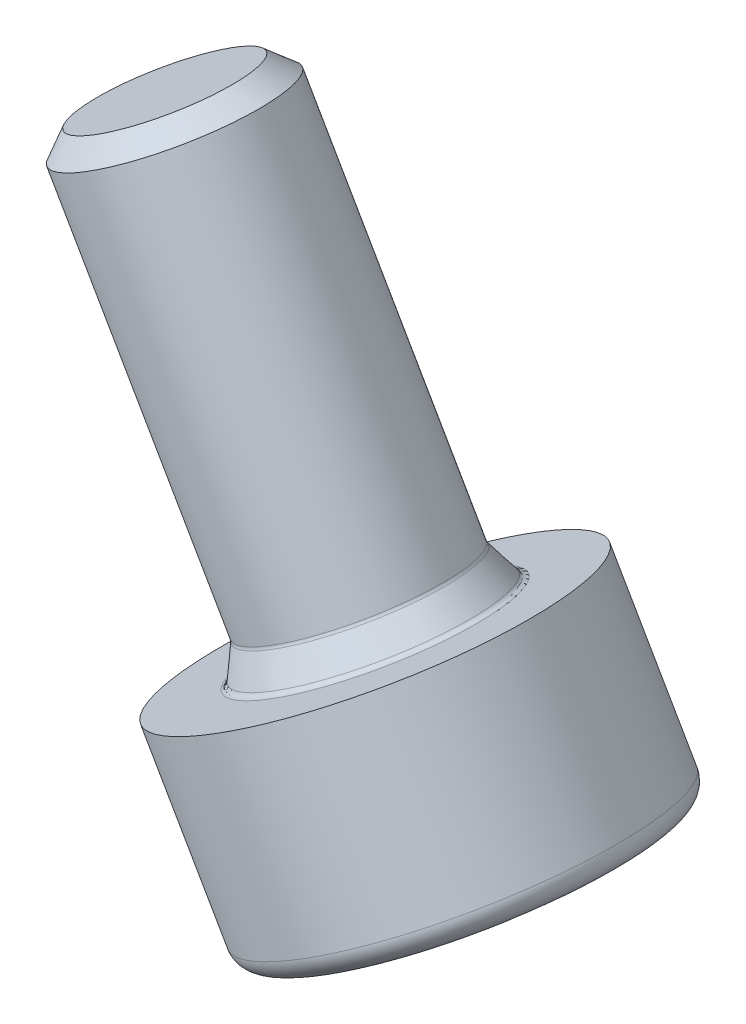
ISO-10303-21;
HEADER;
FILE_DESCRIPTION(('STEP AP214'),'2;1');
FILE_NAME('part.step','',(''),(''),'','','');
FILE_SCHEMA(('AUTOMOTIVE_DESIGN { 1 0 10303 214 1 1 1 1 }'));
ENDSEC;
DATA;
#1=APPLICATION_CONTEXT('core data for automotive mechanical design processes');
#2=APPLICATION_PROTOCOL_DEFINITION('international standard','automotive_design',2000,#1);
#3=PRODUCT_CONTEXT('',#1,'mechanical');
#4=PRODUCT('Part','Part','',(#3));
#5=PRODUCT_RELATED_PRODUCT_CATEGORY('part','',(#4));
#6=PRODUCT_DEFINITION_FORMATION('','',#4);
#7=PRODUCT_DEFINITION_CONTEXT('part definition',#1,'design');
#8=PRODUCT_DEFINITION('design','',#6,#7);
#9=PRODUCT_DEFINITION_SHAPE('','',#8);
#10=(LENGTH_UNIT() NAMED_UNIT(*) SI_UNIT(.MILLI.,.METRE.));
#11=(NAMED_UNIT(*) PLANE_ANGLE_UNIT() SI_UNIT($,.RADIAN.));
#12=(NAMED_UNIT(*) SI_UNIT($,.STERADIAN.) SOLID_ANGLE_UNIT());
#13=UNCERTAINTY_MEASURE_WITH_UNIT(LENGTH_MEASURE(1.E-05),#10,'distance_accuracy_value','');
#14=(GEOMETRIC_REPRESENTATION_CONTEXT(3) GLOBAL_UNCERTAINTY_ASSIGNED_CONTEXT((#13)) GLOBAL_UNIT_ASSIGNED_CONTEXT((#10,
#11,#12)) REPRESENTATION_CONTEXT('',''));
#15=CARTESIAN_POINT('',(0.,0.,0.));
#16=DIRECTION('',(0.,0.,1.));
#17=DIRECTION('',(1.,0.,0.));
#18=AXIS2_PLACEMENT_3D('',#15,#16,#17);
#19=CARTESIAN_POINT('',(231.177788229063,786.535581039937,-362.357299098567));
#20=DIRECTION('',(-0.499999999999994,0.866025403784442,0.));
#21=DIRECTION('',(-0.866025403784442,-0.499999999999994,0.));
#22=AXIS2_PLACEMENT_3D('',#19,#20,#21);
#23=PLANE('',#22);
#24=DIRECTION('',(0.00124392228932108,0.000718178868590491,0.999998968437693));
#25=VECTOR('',#24,1.);
#26=CARTESIAN_POINT('',(230.094359867446,785.910063383709,-363.077190743416));
#27=LINE('',#26,#25);
#28=CARTESIAN_POINT('',(230.095257591401,785.91058168443,-362.355503651395));
#29=VERTEX_POINT('',#28);
#30=CARTESIAN_POINT('',(230.094359867446,785.910063383709,-363.077190743416));
#31=VERTEX_POINT('',#30);
#32=EDGE_CURVE('E164',#29,#31,#27,.F.);
#33=ORIENTED_EDGE('',*,*,#32,.T.);
#34=DIRECTION('',(0.749377265183522,0.432653165778486,-0.501243406508175));
#35=VECTOR('',#34,1.);
#36=CARTESIAN_POINT('',(230.094359867446,785.910063383709,-363.077190743416));
#37=LINE('',#36,#35);
#38=CARTESIAN_POINT('',(230.63517632495,786.222303910585,-363.438932012837));
#39=VERTEX_POINT('',#38);
#40=EDGE_CURVE('E160',#31,#39,#37,.T.);
#41=ORIENTED_EDGE('',*,*,#40,.T.);
#42=CARTESIAN_POINT('',(231.17778822945,786.535581039268,-362.357299098567));
#43=DIRECTION('',(0.499999999999982,-0.866025403784449,-1.76969799723513E-13));
#44=DIRECTION('',(0.866025403784449,0.499999999999982,0.));
#45=AXIS2_PLACEMENT_3D('',#42,#43,#44);
#46=CIRCLE('',#45,1.2499999995943);
#47=EDGE_CURVE('E161',#39,#29,#46,.F.);
#48=ORIENTED_EDGE('',*,*,#47,.T.);
#49=EDGE_LOOP('',(#33,#41,#48));
#50=FACE_BOUND('',#49,.T.);
#51=ADVANCED_FACE('F17',(#50),#23,.F.);
#52=CARTESIAN_POINT('',(231.177788229063,786.535581039937,-362.357299098567));
#53=DIRECTION('',(-0.499999999999994,0.866025403784442,0.));
#54=DIRECTION('',(-0.866025403784442,-0.499999999999994,0.));
#55=AXIS2_PLACEMENT_3D('',#52,#53,#54);
#56=PLANE('',#55);
#57=DIRECTION('',(-0.750621187472531,-0.433371344647624,-0.498755561929525));
#58=VECTOR('',#57,1.);
#59=CARTESIAN_POINT('',(230.637869495426,786.223858813731,-361.273870736949));
#60=LINE('',#59,#58);
#61=CARTESIAN_POINT('',(230.637869495707,786.223858813447,-361.273870737125));
#62=VERTEX_POINT('',#61);
#63=CARTESIAN_POINT('',(230.096155314618,785.911099985617,-361.633816559374));
#64=VERTEX_POINT('',#63);
#65=EDGE_CURVE('E524',#62,#64,#60,.T.);
#66=ORIENTED_EDGE('',*,*,#65,.T.);
#67=DIRECTION('',(0.00124392228932108,0.000718178868590491,0.999998968437693));
#68=VECTOR('',#67,1.);
#69=CARTESIAN_POINT('',(230.094359867446,785.910063383709,-363.077190743416));
#70=LINE('',#69,#68);
#71=EDGE_CURVE('E552',#64,#29,#70,.F.);
#72=ORIENTED_EDGE('',*,*,#71,.T.);
#73=CARTESIAN_POINT('',(231.17778822945,786.535581039268,-362.357299098567));
#74=DIRECTION('',(0.499999999999982,-0.866025403784449,-1.76969799723513E-13));
#75=DIRECTION('',(0.866025403784449,0.499999999999982,0.));
#76=AXIS2_PLACEMENT_3D('',#73,#74,#75);
#77=CIRCLE('',#76,1.24999999959429);
#78=EDGE_CURVE('E179',#62,#29,#77,.T.);
#79=ORIENTED_EDGE('',*,*,#78,.F.);
#80=EDGE_LOOP('',(#66,#72,#79));
#81=FACE_BOUND('',#80,.T.);
#82=ADVANCED_FACE('F756',(#81),#56,.F.);
#83=CARTESIAN_POINT('',(230.094359867446,785.910063383709,-363.077190743416));
#84=DIRECTION('',(-0.866024510425279,-0.49999948421884,0.001436357737181));
#85=DIRECTION('',(0.499999999999994,-0.866025403784442,0.));
#86=AXIS2_PLACEMENT_3D('',#83,#84,#85);
#87=PLANE('',#86);
#88=DIRECTION('',(0.00124392228932108,0.000718178868590491,0.999998968437693));
#89=VECTOR('',#88,1.);
#90=CARTESIAN_POINT('',(231.019359867446,784.307916386708,-363.077190743416));
#91=LINE('',#90,#89);
#92=CARTESIAN_POINT('',(231.019359867446,784.307916386708,-363.077190743416));
#93=VERTEX_POINT('',#92);
#94=CARTESIAN_POINT('',(231.01938089054,784.307928524356,-363.060290125977));
#95=VERTEX_POINT('',#94);
#96=EDGE_CURVE('E428',#93,#95,#91,.T.);
#97=ORIENTED_EDGE('',*,*,#96,.F.);
#98=DIRECTION('',(-0.50000000000004,0.866025403784416,0.));
#99=VECTOR('',#98,1.);
#100=CARTESIAN_POINT('',(231.019359867446,784.307916386708,-363.077190743416));
#101=LINE('',#100,#99);
#102=EDGE_CURVE('E169',#93,#31,#101,.T.);
#103=ORIENTED_EDGE('',*,*,#102,.T.);
#104=ORIENTED_EDGE('',*,*,#32,.F.);
#105=ORIENTED_EDGE('',*,*,#71,.F.);
#106=DIRECTION('',(0.49999999999974,-0.866025403784589,-1.80036166155497E-13));
#107=VECTOR('',#106,1.);
#108=CARTESIAN_POINT('',(230.096155314618,785.911099985617,-361.633816559374));
#109=LINE('',#108,#107);
#110=CARTESIAN_POINT('',(231.021155314617,784.308952988616,-361.633816559374));
#111=VERTEX_POINT('',#110);
#112=EDGE_CURVE('E514',#64,#111,#109,.T.);
#113=ORIENTED_EDGE('',*,*,#112,.T.);
#114=DIRECTION('',(0.00124392228932108,0.000718178868590491,0.999998968437693));
#115=VECTOR('',#114,1.);
#116=CARTESIAN_POINT('',(231.019359867446,784.307916386708,-363.077190743416));
#117=LINE('',#116,#115);
#118=CARTESIAN_POINT('',(231.021134291597,784.308940850841,-361.650717176661));
#119=VERTEX_POINT('',#118);
#120=EDGE_CURVE('E182',#119,#111,#117,.T.);
#121=ORIENTED_EDGE('',*,*,#120,.F.);
#122=CARTESIAN_POINT('',(231.019380890574,784.307928524254,-363.060290126216));
#123=CARTESIAN_POINT('',(231.007583608695,784.328500835787,-363.011966594581));
#124=CARTESIAN_POINT('',(230.996499364921,784.347840408368,-362.962849637441));
#125=CARTESIAN_POINT('',(230.976230728111,784.383234326375,-362.862732187299));
#126=CARTESIAN_POINT('',(230.967058205752,784.399268138707,-362.811722115185));
#127=CARTESIAN_POINT('',(230.951272231896,784.426907345349,-362.708301649146));
#128=CARTESIAN_POINT('',(230.944649205501,784.438529306504,-362.655897300736));
#129=CARTESIAN_POINT('',(230.934505803146,784.456402434034,-362.549990893219));
#130=CARTESIAN_POINT('',(230.930976331509,784.462669343971,-362.496492528635));
#131=CARTESIAN_POINT('',(230.928682481364,784.46683842095,-362.428260299855));
#132=CARTESIAN_POINT('',(230.928320229856,784.467507640084,-362.413716195168));
#133=CARTESIAN_POINT('',(230.927848669362,784.468408001708,-362.384616618869));
#134=CARTESIAN_POINT('',(230.927739245638,784.468639342905,-362.370061155412));
#135=CARTESIAN_POINT('',(230.927805399981,784.468675564302,-362.31756590289));
#136=CARTESIAN_POINT('',(230.928720959577,784.467198792846,-362.279614295807));
#137=CARTESIAN_POINT('',(230.932236862941,784.461326267422,-362.204007221366));
#138=CARTESIAN_POINT('',(230.934838394426,784.456928455614,-362.166351981732));
#139=CARTESIAN_POINT('',(230.945010491775,784.439632897603,-362.053903990347));
#140=CARTESIAN_POINT('',(230.954946572876,784.422635608005,-361.979929564824));
#141=CARTESIAN_POINT('',(230.974724278398,784.388714251387,-361.863442616628));
#142=CARTESIAN_POINT('',(230.983104965188,784.374323661394,-361.819865310955));
#143=CARTESIAN_POINT('',(231.001199910739,784.343228217182,-361.73425969141));
#144=CARTESIAN_POINT('',(231.010902105865,784.326544286762,-361.692221292683));
#145=CARTESIAN_POINT('',(231.021134291617,784.308940850806,-361.650717176578));
#146=B_SPLINE_CURVE_WITH_KNOTS('',3,(#122,#123,#124,#125,#126,#127,#128,#129,#130,#131,#132,
#133,#134,#135,#136,#137,#138,#139,#140,#141,#142,#143,#144,#145),.UNSPECIFIED.,.F.,.F.,(4,2,2,
2,2,2,2,2,2,2,2,4),(0.,0.16159297617679,0.324161275137199,0.486112932434917,0.647586806154177,
0.691272786513411,0.734938937457356,0.848735605540267,0.962612527244451,1.19125625184068,
1.33113310605229,1.46980937840952),.UNSPECIFIED.);
#147=EDGE_CURVE('E423',#95,#119,#146,.T.);
#148=ORIENTED_EDGE('',*,*,#147,.F.);
#149=EDGE_LOOP('',(#97,#103,#104,#105,#113,#121,#148));
#150=FACE_BOUND('',#149,.T.);
#151=ADVANCED_FACE('F414',(#150),#87,.F.);
#152=CARTESIAN_POINT('',(231.175992781892,786.534544438029,-363.800673282609));
#153=DIRECTION('',(-0.434089523515526,-0.250621703254081,-0.865306331556685));
#154=DIRECTION('',(-0.893832919324595,0.,0.448400169861333));
#155=AXIS2_PLACEMENT_3D('',#152,#153,#154);
#156=PLANE('',#155);
#157=DIRECTION('',(-0.50000000000004,0.866025403784416,0.));
#158=VECTOR('',#157,1.);
#159=CARTESIAN_POINT('',(232.100992781892,784.932397441028,-363.800673282608));
#160=LINE('',#159,#158);
#161=CARTESIAN_POINT('',(232.100992781892,784.932397441028,-363.800673282609));
#162=VERTEX_POINT('',#161);
#163=CARTESIAN_POINT('',(231.175992781892,786.534544438029,-363.800673282609));
#164=VERTEX_POINT('',#163);
#165=EDGE_CURVE('E174',#162,#164,#160,.T.);
#166=ORIENTED_EDGE('',*,*,#165,.T.);
#167=DIRECTION('',(-0.749377265183826,-0.432653165778377,0.501243406507815));
#168=VECTOR('',#167,1.);
#169=CARTESIAN_POINT('',(231.175992781892,786.534544438029,-363.800673282609));
#170=LINE('',#169,#168);
#171=EDGE_CURVE('E148',#164,#39,#170,.T.);
#172=ORIENTED_EDGE('',*,*,#171,.T.);
#173=ORIENTED_EDGE('',*,*,#40,.F.);
#174=ORIENTED_EDGE('',*,*,#102,.F.);
#175=DIRECTION('',(-0.749377265177957,-0.432653165787645,0.50124340650859));
#176=VECTOR('',#175,1.);
#177=CARTESIAN_POINT('',(231.032024818752,784.315228499754,-363.085662075055));
#178=LINE('',#177,#176);
#179=CARTESIAN_POINT('',(231.032024818937,784.315228499733,-363.085662075153));
#180=VERTEX_POINT('',#179);
#181=EDGE_CURVE('E422',#180,#93,#178,.T.);
#182=ORIENTED_EDGE('',*,*,#181,.F.);
#183=CARTESIAN_POINT('',(232.088327830592,784.925085327822,-363.792201950952));
#184=CARTESIAN_POINT('',(232.04025784459,784.924715583866,-363.767980074342));
#185=CARTESIAN_POINT('',(231.992305334087,784.922769252727,-363.743360498026));
#186=CARTESIAN_POINT('',(231.896886340439,784.914775091985,-363.693177234494));
#187=CARTESIAN_POINT('',(231.849424537679,784.908702577971,-363.667608745807));
#188=CARTESIAN_POINT('',(231.756008890717,784.891522271947,-363.615769865633));
#189=CARTESIAN_POINT('',(231.710050009512,784.880433666739,-363.589502504424));
#190=CARTESIAN_POINT('',(231.620410931783,784.852409944692,-363.536417561188));
#191=CARTESIAN_POINT('',(231.576724412772,784.835492172516,-363.509601831018));
#192=CARTESIAN_POINT('',(231.523213953201,784.810091326258,-363.475400840953));
#193=CARTESIAN_POINT('',(231.5119345773,784.804457540685,-363.468110696856));
#194=CARTESIAN_POINT('',(231.489620235759,784.792746966789,-363.453524711054));
#195=CARTESIAN_POINT('',(231.478585161503,784.786670380709,-363.446228873439));
#196=CARTESIAN_POINT('',(231.439247226418,784.763956640464,-363.419915947089));
#197=CARTESIAN_POINT('',(231.411675476246,784.74603271305,-363.400892934657));
#198=CARTESIAN_POINT('',(231.358439049063,784.707394214312,-363.36299534802));
#199=CARTESIAN_POINT('',(231.332775730704,784.686677683836,-363.344120887961));
#200=CARTESIAN_POINT('',(231.258541896164,784.620650338326,-363.287757015559));
#201=CARTESIAN_POINT('',(231.212951148855,784.5715946194,-363.250677784267));
#202=CARTESIAN_POINT('',(231.1452911928,784.487191105333,-363.19228940931));
#203=CARTESIAN_POINT('',(231.120961796916,784.453915340303,-363.170446549635));
#204=CARTESIAN_POINT('',(231.074799284384,784.385720835368,-363.127537253014));
#205=CARTESIAN_POINT('',(231.052946534186,784.350818648771,-363.106465761094));
#206=CARTESIAN_POINT('',(231.032024818886,784.315228499656,-363.085662075094));
#207=B_SPLINE_CURVE_WITH_KNOTS('',3,(#183,#184,#185,#186,#187,#188,#189,#190,#191,#192,#193,
#194,#195,#196,#197,#198,#199,#200,#201,#202,#203,#204,#205,#206),.UNSPECIFIED.,.F.,.F.,(4,2,2,
2,2,2,2,2,2,2,2,4),(0.,0.161592976179455,0.324161275141715,0.486112932437444,0.647586806155135,
0.691272786514263,0.734938937458076,0.848735605541466,0.962612527245416,1.1912562518407,
1.33113310605297,1.46980937841171),.UNSPECIFIED.);
#208=CARTESIAN_POINT('',(232.088327830442,784.925085327899,-363.792201950874));
#209=VERTEX_POINT('',#208);
#210=EDGE_CURVE('E417',#209,#180,#207,.T.);
#211=ORIENTED_EDGE('',*,*,#210,.F.);
#212=DIRECTION('',(-0.749377265175107,-0.432653165793516,0.501243406507782));
#213=VECTOR('',#212,1.);
#214=CARTESIAN_POINT('',(232.100992781892,784.932397441028,-363.800673282609));
#215=LINE('',#214,#213);
#216=EDGE_CURVE('E168',#162,#209,#215,.T.);
#217=ORIENTED_EDGE('',*,*,#216,.F.);
#218=EDGE_LOOP('',(#166,#172,#173,#174,#182,#211,#217));
#219=FACE_BOUND('',#218,.T.);
#220=ADVANCED_FACE('F171',(#219),#156,.F.);
#221=CARTESIAN_POINT('',(231.177788229063,786.535581039937,-362.357299098567));
#222=DIRECTION('',(-0.499999999999994,0.866025403784442,0.));
#223=DIRECTION('',(-0.866025403784442,-0.499999999999994,0.));
#224=AXIS2_PLACEMENT_3D('',#221,#222,#223);
#225=PLANE('',#224);
#226=ORIENTED_EDGE('',*,*,#171,.F.);
#227=DIRECTION('',(0.750621187472963,0.433371344646899,0.498755561929507));
#228=VECTOR('',#227,1.);
#229=CARTESIAN_POINT('',(231.175992781892,786.534544438029,-363.800673282608));
#230=LINE('',#229,#228);
#231=CARTESIAN_POINT('',(231.717706962807,786.847303265758,-363.440727460008));
#232=VERTEX_POINT('',#231);
#233=EDGE_CURVE('E150',#164,#232,#230,.T.);
#234=ORIENTED_EDGE('',*,*,#233,.T.);
#235=CARTESIAN_POINT('',(231.17778822945,786.535581039268,-362.357299098567));
#236=DIRECTION('',(0.499999999999982,-0.866025403784449,-1.76969799723513E-13));
#237=DIRECTION('',(0.866025403784449,0.499999999999982,0.));
#238=AXIS2_PLACEMENT_3D('',#235,#236,#237);
#239=CIRCLE('',#238,1.24999999959421);
#240=EDGE_CURVE('E144',#232,#39,#239,.F.);
#241=ORIENTED_EDGE('',*,*,#240,.T.);
#242=EDGE_LOOP('',(#226,#234,#241));
#243=FACE_BOUND('',#242,.T.);
#244=ADVANCED_FACE('F146',(#243),#225,.F.);
#245=CARTESIAN_POINT('',(231.177788229418,786.535581039324,-362.357299098567));
#246=DIRECTION('',(0.499999999999982,-0.866025403784449,-1.76969799723513E-13));
#247=DIRECTION('',(0.866025403784449,0.499999999999982,0.));
#248=AXIS2_PLACEMENT_3D('',#245,#246,#247);
#249=CONICAL_SURFACE('',#248,1.24999999948057,1.04719754998824);
#250=CARTESIAN_POINT('',(231.17778822945,786.535581039268,-362.357299098567));
#251=DIRECTION('',(0.499999999999982,-0.866025403784449,-1.76969799723513E-13));
#252=DIRECTION('',(0.866025403784449,0.499999999999982,0.));
#253=AXIS2_PLACEMENT_3D('',#250,#251,#252);
#254=CIRCLE('',#253,1.24999999959426);
#255=CARTESIAN_POINT('',(231.720400133563,786.848858168618,-361.275666184297));
#256=VERTEX_POINT('',#255);
#257=EDGE_CURVE('E155',#256,#62,#254,.T.);
#258=ORIENTED_EDGE('',*,*,#257,.T.);
#259=ORIENTED_EDGE('',*,*,#78,.T.);
#260=ORIENTED_EDGE('',*,*,#47,.F.);
#261=ORIENTED_EDGE('',*,*,#240,.F.);
#262=CARTESIAN_POINT('',(231.17778822945,786.535581039268,-362.357299098567));
#263=DIRECTION('',(0.499999999999982,-0.866025403784449,-1.76969799723513E-13));
#264=DIRECTION('',(0.866025403784449,0.499999999999982,0.));
#265=AXIS2_PLACEMENT_3D('',#262,#263,#264);
#266=CIRCLE('',#265,1.24999999959419);
#267=CARTESIAN_POINT('',(232.260318867113,787.160580394774,-362.359094545738));
#268=VERTEX_POINT('',#267);
#269=EDGE_CURVE('E382',#232,#268,#266,.T.);
#270=ORIENTED_EDGE('',*,*,#269,.T.);
#271=CARTESIAN_POINT('',(231.17778822945,786.535581039268,-362.357299098567));
#272=DIRECTION('',(0.499999999999982,-0.866025403784449,-1.76969799723513E-13));
#273=DIRECTION('',(0.866025403784449,0.499999999999982,0.));
#274=AXIS2_PLACEMENT_3D('',#271,#272,#273);
#275=CIRCLE('',#274,1.24999999959424);
#276=EDGE_CURVE('E793',#268,#256,#275,.T.);
#277=ORIENTED_EDGE('',*,*,#276,.T.);
#278=EDGE_LOOP('',(#258,#259,#260,#261,#270,#277));
#279=FACE_BOUND('',#278,.T.);
#280=CARTESIAN_POINT('',(230.816944310339,787.160581040775,-362.357299098595));
#281=VERTEX_POINT('',#280);
#282=VERTEX_LOOP('',#281);
#283=FACE_BOUND('',#282,.T.);
#284=ADVANCED_FACE('F176',(#279,#283),#249,.F.);
#285=CARTESIAN_POINT('',(231.177788229063,786.535581039937,-362.357299098567));
#286=DIRECTION('',(-0.499999999999994,0.866025403784442,0.));
#287=DIRECTION('',(-0.866025403784442,-0.499999999999994,0.));
#288=AXIS2_PLACEMENT_3D('',#285,#286,#287);
#289=PLANE('',#288);
#290=DIRECTION('',(-0.74937726518358,-0.432653165778369,0.501243406508189));
#291=VECTOR('',#290,1.);
#292=CARTESIAN_POINT('',(231.720400133458,786.848858169004,-361.275666184121));
#293=LINE('',#292,#291);
#294=CARTESIAN_POINT('',(231.179583676235,786.536617641844,-360.913924914525));
#295=VERTEX_POINT('',#294);
#296=EDGE_CURVE('E509',#256,#295,#293,.T.);
#297=ORIENTED_EDGE('',*,*,#296,.T.);
#298=DIRECTION('',(-0.750621187473525,-0.433371344645908,-0.498755561929521));
#299=VECTOR('',#298,1.);
#300=CARTESIAN_POINT('',(231.179583676235,786.536617641844,-360.913924914525));
#301=LINE('',#300,#299);
#302=EDGE_CURVE('E519',#295,#62,#301,.T.);
#303=ORIENTED_EDGE('',*,*,#302,.T.);
#304=ORIENTED_EDGE('',*,*,#257,.F.);
#305=EDGE_LOOP('',(#297,#303,#304));
#306=FACE_BOUND('',#305,.T.);
#307=ADVANCED_FACE('F402',(#306),#289,.F.);
#308=CARTESIAN_POINT('',(230.096155314618,785.911099985617,-361.633816559374));
#309=DIRECTION('',(-0.431934986909754,-0.24937778096476,0.866742689293866));
#310=DIRECTION('',(0.895019691172795,0.,0.446026627470776));
#311=AXIS2_PLACEMENT_3D('',#308,#309,#310);
#312=PLANE('',#311);
#313=ORIENTED_EDGE('',*,*,#112,.F.);
#314=ORIENTED_EDGE('',*,*,#65,.F.);
#315=ORIENTED_EDGE('',*,*,#302,.F.);
#316=DIRECTION('',(0.500000000000029,-0.866025403784422,0.));
#317=VECTOR('',#316,1.);
#318=CARTESIAN_POINT('',(231.179583676235,786.536617641844,-360.913924914525));
#319=LINE('',#318,#317);
#320=CARTESIAN_POINT('',(232.104583676235,784.934470644843,-360.913924914525));
#321=VERTEX_POINT('',#320);
#322=EDGE_CURVE('E505',#295,#321,#319,.T.);
#323=ORIENTED_EDGE('',*,*,#322,.T.);
#324=DIRECTION('',(0.750621187497313,0.43337134460588,0.498755561928502));
#325=VECTOR('',#324,1.);
#326=CARTESIAN_POINT('',(232.091897701852,784.927146394119,-360.922354200012));
#327=LINE('',#326,#325);
#328=CARTESIAN_POINT('',(232.091897701769,784.927146393942,-360.922354200092));
#329=VERTEX_POINT('',#328);
#330=EDGE_CURVE('E517',#329,#321,#327,.T.);
#331=ORIENTED_EDGE('',*,*,#330,.F.);
#332=CARTESIAN_POINT('',(231.033841289117,784.316277239245,-361.625387273832));
#333=CARTESIAN_POINT('',(231.058256600569,784.357756901285,-361.601285618806));
#334=CARTESIAN_POINT('',(231.083979525777,784.398347102787,-361.576788237981));
#335=CARTESIAN_POINT('',(231.138736707345,784.477057197231,-361.526854051369));
#336=CARTESIAN_POINT('',(231.167790012756,784.515160701517,-361.501412467942));
#337=CARTESIAN_POINT('',(231.229505064853,784.587545146354,-361.449830882077));
#338=CARTESIAN_POINT('',(231.262152706262,784.621840038138,-361.423693894877));
#339=CARTESIAN_POINT('',(231.331373239806,784.685533955422,-361.370872430597));
#340=CARTESIAN_POINT('',(231.36793426767,784.714947126036,-361.344189796184));
#341=CARTESIAN_POINT('',(231.416772151268,784.748637123258,-361.310158557469));
#342=CARTESIAN_POINT('',(231.427308932397,784.75559890182,-361.302904596879));
#343=CARTESIAN_POINT('',(231.448643955306,784.769089300239,-361.288391006381));
#344=CARTESIAN_POINT('',(231.459442076236,784.775618115276,-361.28113138054));
#345=CARTESIAN_POINT('',(231.498847019934,784.798366597293,-361.254949054367));
#346=CARTESIAN_POINT('',(231.528202680386,784.813309725728,-361.236020459716));
#347=CARTESIAN_POINT('',(231.588376864866,784.840148874161,-361.198310971912));
#348=CARTESIAN_POINT('',(231.619196405957,784.852042737794,-361.179530192337));
#349=CARTESIAN_POINT('',(231.713634558494,784.883398209427,-361.123446073355));
#350=CARTESIAN_POINT('',(231.779005449469,784.898406222234,-361.086550879124));
#351=CARTESIAN_POINT('',(231.886075915707,784.914883364514,-361.028452305886));
#352=CARTESIAN_POINT('',(231.927112478334,784.919346653225,-361.006717859887));
#353=CARTESIAN_POINT('',(232.009358395119,784.925288789524,-360.964021536963));
#354=CARTESIAN_POINT('',(232.050563243013,784.92679292416,-360.943054630155));
#355=CARTESIAN_POINT('',(232.09189770187,784.927146393954,-360.92235420005));
#356=B_SPLINE_CURVE_WITH_KNOTS('',3,(#332,#333,#334,#335,#336,#337,#338,#339,#340,#341,#342,
#343,#344,#345,#346,#347,#348,#349,#350,#351,#352,#353,#354,#355),.UNSPECIFIED.,.F.,.F.,(4,2,2,
2,2,2,2,2,2,2,2,4),(0.,0.161592976179371,0.32416127514145,0.486112932436945,0.647586806154291,
0.691272786513653,0.734938937457772,0.848735605541371,0.962612527245353,1.19125625184065,
1.33113310605191,1.46980937840978),.UNSPECIFIED.);
#357=CARTESIAN_POINT('',(231.033841289145,784.316277239424,-361.625387273791));
#358=VERTEX_POINT('',#357);
#359=EDGE_CURVE('E383',#358,#329,#356,.T.);
#360=ORIENTED_EDGE('',*,*,#359,.F.);
#361=DIRECTION('',(0.750621187495367,0.433371344605704,0.498755561931584));
#362=VECTOR('',#361,1.);
#363=CARTESIAN_POINT('',(231.021155314617,784.308952988616,-361.633816559374));
#364=LINE('',#363,#362);
#365=EDGE_CURVE('E381',#111,#358,#364,.T.);
#366=ORIENTED_EDGE('',*,*,#365,.F.);
#367=EDGE_LOOP('',(#313,#314,#315,#323,#331,#360,#366));
#368=FACE_BOUND('',#367,.T.);
#369=ADVANCED_FACE('F396',(#368),#312,.F.);
#370=CARTESIAN_POINT('',(232.259421143509,787.160062094256,-363.080781637759));
#371=DIRECTION('',(0.431934986909754,0.24937778096476,-0.866742689293866));
#372=DIRECTION('',(-0.895019691172795,0.,-0.446026627470776));
#373=AXIS2_PLACEMENT_3D('',#370,#371,#372);
#374=PLANE('',#373);
#375=DIRECTION('',(-0.499999999999994,0.866025403784442,0.));
#376=VECTOR('',#375,1.);
#377=CARTESIAN_POINT('',(232.25942114351,787.160062094256,-363.080781637759));
#378=LINE('',#377,#376);
#379=CARTESIAN_POINT('',(233.184421143509,785.557915097255,-363.080781637759));
#380=VERTEX_POINT('',#379);
#381=CARTESIAN_POINT('',(232.259421143509,787.160062094256,-363.080781637759));
#382=VERTEX_POINT('',#381);
#383=EDGE_CURVE('E802',#380,#382,#378,.T.);
#384=ORIENTED_EDGE('',*,*,#383,.T.);
#385=DIRECTION('',(-0.750621187472558,-0.433371344646763,-0.498755561930234));
#386=VECTOR('',#385,1.);
#387=CARTESIAN_POINT('',(232.259421143509,787.160062094257,-363.080781637759));
#388=LINE('',#387,#386);
#389=EDGE_CURVE('E823',#382,#232,#388,.T.);
#390=ORIENTED_EDGE('',*,*,#389,.T.);
#391=ORIENTED_EDGE('',*,*,#233,.F.);
#392=ORIENTED_EDGE('',*,*,#165,.F.);
#393=DIRECTION('',(-0.750621187485129,-0.433371344626342,-0.498755561929059));
#394=VECTOR('',#393,1.);
#395=CARTESIAN_POINT('',(232.113678756274,784.939721691752,-363.792243997122));
#396=LINE('',#395,#394);
#397=CARTESIAN_POINT('',(232.113678756431,784.939721691715,-363.792243997043));
#398=VERTEX_POINT('',#397);
#399=EDGE_CURVE('E380',#398,#162,#396,.T.);
#400=ORIENTED_EDGE('',*,*,#399,.F.);
#401=CARTESIAN_POINT('',(233.171735169151,785.550590846382,-363.089210923301));
#402=CARTESIAN_POINT('',(233.123605072357,785.550186397443,-363.113312578327));
#403=CARTESIAN_POINT('',(233.075591464108,785.548204791505,-363.137809959152));
#404=CARTESIAN_POINT('',(232.980047932001,785.540138728449,-363.187744145764));
#405=CARTESIAN_POINT('',(232.932522676611,785.534029580042,-363.213185729191));
#406=CARTESIAN_POINT('',(232.838978382495,785.516774999549,-363.264767315056));
#407=CARTESIAN_POINT('',(232.792954314285,785.505648758607,-363.290904302257));
#408=CARTESIAN_POINT('',(232.703183497078,785.477548976736,-363.343725766536));
#409=CARTESIAN_POINT('',(232.659430430189,785.460592783125,-363.37040840095));
#410=CARTESIAN_POINT('',(232.605835094942,785.435142933873,-363.404439639664));
#411=CARTESIAN_POINT('',(232.594537627288,785.429498703022,-363.411693600254));
#412=CARTESIAN_POINT('',(232.572187088095,785.417767230402,-363.426207190752));
#413=CARTESIAN_POINT('',(232.561133907952,785.411680190883,-363.433466816593));
#414=CARTESIAN_POINT('',(232.521730672779,785.388928749614,-363.459649142765));
#415=CARTESIAN_POINT('',(232.494111713716,785.370977566135,-363.478577737416));
#416=CARTESIAN_POINT('',(232.440781237117,785.33228476794,-363.516287225221));
#417=CARTESIAN_POINT('',(232.415071078516,785.311541194239,-363.535068004796));
#418=CARTESIAN_POINT('',(232.340697367266,785.245433090872,-363.591152123778));
#419=CARTESIAN_POINT('',(232.295014601427,785.196324245023,-363.628047318009));
#420=CARTESIAN_POINT('',(232.227209744511,785.111837072406,-363.686145891247));
#421=CARTESIAN_POINT('',(232.202826141789,785.078530011043,-363.707880337246));
#422=CARTESIAN_POINT('',(232.156557142409,785.010274025898,-363.75057666017));
#423=CARTESIAN_POINT('',(232.134652099656,784.97534164818,-363.771543566979));
#424=CARTESIAN_POINT('',(232.113678756407,784.939721691655,-363.792243997083));
#425=B_SPLINE_CURVE_WITH_KNOTS('',3,(#401,#402,#403,#404,#405,#406,#407,#408,#409,#410,#411,
#412,#413,#414,#415,#416,#417,#418,#419,#420,#421,#422,#423,#424),.UNSPECIFIED.,.F.,.F.,(4,2,2,
2,2,2,2,2,2,2,2,4),(0.,0.161592976179436,0.324161275141778,0.486112932437504,0.647586806155194,
0.691272786514085,0.734938937457693,0.848735605541069,0.96261252724501,1.19125625184018,
1.33113310605259,1.4698093784119),.UNSPECIFIED.);
#426=CARTESIAN_POINT('',(233.171735168982,785.550590846447,-363.089210923342));
#427=VERTEX_POINT('',#426);
#428=EDGE_CURVE('E372',#427,#398,#425,.T.);
#429=ORIENTED_EDGE('',*,*,#428,.F.);
#430=DIRECTION('',(-0.750621187481045,-0.433371344631502,-0.498755561930722));
#431=VECTOR('',#430,1.);
#432=CARTESIAN_POINT('',(233.184421143509,785.557915097255,-363.080781637759));
#433=LINE('',#432,#431);
#434=EDGE_CURVE('E496',#380,#427,#433,.T.);
#435=ORIENTED_EDGE('',*,*,#434,.F.);
#436=EDGE_LOOP('',(#384,#390,#391,#392,#400,#429,#435));
#437=FACE_BOUND('',#436,.T.);
#438=ADVANCED_FACE('F391',(#437),#374,.F.);
#439=CARTESIAN_POINT('',(231.177788229063,786.535581039937,-362.357299098567));
#440=DIRECTION('',(-0.499999999999994,0.866025403784442,0.));
#441=DIRECTION('',(-0.866025403784442,-0.499999999999994,0.));
#442=AXIS2_PLACEMENT_3D('',#439,#440,#441);
#443=PLANE('',#442);
#444=ORIENTED_EDGE('',*,*,#389,.F.);
#445=DIRECTION('',(0.00124392228932108,0.000718178868590491,0.999998968437693));
#446=VECTOR('',#445,1.);
#447=CARTESIAN_POINT('',(232.261216590681,787.161098696164,-361.637407453717));
#448=LINE('',#447,#446);
#449=EDGE_CURVE('E816',#382,#268,#448,.T.);
#450=ORIENTED_EDGE('',*,*,#449,.T.);
#451=ORIENTED_EDGE('',*,*,#269,.F.);
#452=EDGE_LOOP('',(#444,#450,#451));
#453=FACE_BOUND('',#452,.T.);
#454=ADVANCED_FACE('F395',(#453),#443,.F.);
#455=CARTESIAN_POINT('',(231.177788229063,786.535581039937,-362.357299098567));
#456=DIRECTION('',(-0.499999999999994,0.866025403784442,0.));
#457=DIRECTION('',(-0.866025403784442,-0.499999999999994,0.));
#458=AXIS2_PLACEMENT_3D('',#455,#456,#457);
#459=PLANE('',#458);
#460=DIRECTION('',(0.00124392228932108,0.000718178868590491,0.999998968437693));
#461=VECTOR('',#460,1.);
#462=CARTESIAN_POINT('',(232.261216590681,787.161098696164,-361.637407453717));
#463=LINE('',#462,#461);
#464=CARTESIAN_POINT('',(232.261216590681,787.161098696164,-361.637407453717));
#465=VERTEX_POINT('',#464);
#466=EDGE_CURVE('E339',#268,#465,#463,.T.);
#467=ORIENTED_EDGE('',*,*,#466,.T.);
#468=DIRECTION('',(-0.74937726518348,-0.432653165778619,0.501243406508123));
#469=VECTOR('',#468,1.);
#470=CARTESIAN_POINT('',(232.261216590681,787.161098696164,-361.637407453718));
#471=LINE('',#470,#469);
#472=EDGE_CURVE('E528',#465,#256,#471,.T.);
#473=ORIENTED_EDGE('',*,*,#472,.T.);
#474=ORIENTED_EDGE('',*,*,#276,.F.);
#475=EDGE_LOOP('',(#467,#473,#474));
#476=FACE_BOUND('',#475,.T.);
#477=ADVANCED_FACE('F704',(#476),#459,.F.);
#478=CARTESIAN_POINT('',(231.179583676235,786.536617641844,-360.913924914525));
#479=DIRECTION('',(0.434089523515526,0.250621703254081,0.865306331556685));
#480=DIRECTION('',(0.893832919324595,0.,-0.448400169861333));
#481=AXIS2_PLACEMENT_3D('',#478,#479,#480);
#482=PLANE('',#481);
#483=ORIENTED_EDGE('',*,*,#322,.F.);
#484=ORIENTED_EDGE('',*,*,#296,.F.);
#485=ORIENTED_EDGE('',*,*,#472,.F.);
#486=DIRECTION('',(-0.499999999999994,0.866025403784442,0.));
#487=VECTOR('',#486,1.);
#488=CARTESIAN_POINT('',(232.261216590681,787.161098696164,-361.637407453717));
#489=LINE('',#488,#487);
#490=CARTESIAN_POINT('',(233.186216590681,785.558951699163,-361.637407453717));
#491=VERTEX_POINT('',#490);
#492=EDGE_CURVE('E333',#465,#491,#489,.F.);
#493=ORIENTED_EDGE('',*,*,#492,.T.);
#494=DIRECTION('',(0.749377265190201,0.432653165767217,-0.501243406507915));
#495=VECTOR('',#494,1.);
#496=CARTESIAN_POINT('',(233.173551639374,785.551639586117,-361.628936122078));
#497=LINE('',#496,#495);
#498=CARTESIAN_POINT('',(233.173551639319,785.551639585957,-361.628936122017));
#499=VERTEX_POINT('',#498);
#500=EDGE_CURVE('E808',#499,#491,#497,.T.);
#501=ORIENTED_EDGE('',*,*,#500,.F.);
#502=CARTESIAN_POINT('',(232.117248627677,784.941782757804,-360.922396246182));
#503=CARTESIAN_POINT('',(232.141603828337,784.983227714863,-360.946618122792));
#504=CARTESIAN_POINT('',(232.167265655799,785.023782641564,-360.971237699108));
#505=CARTESIAN_POINT('',(232.221898298907,785.102420833695,-361.02142096264));
#506=CARTESIAN_POINT('',(232.250888151688,785.140487703588,-361.046989451327));
#507=CARTESIAN_POINT('',(232.31247455663,785.212797873956,-361.098828331501));
#508=CARTESIAN_POINT('',(232.345057011035,785.247055130006,-361.12509569271));
#509=CARTESIAN_POINT('',(232.414145805101,785.310672987467,-361.178180635946));
#510=CARTESIAN_POINT('',(232.450640285087,785.340047736645,-361.204996366116));
#511=CARTESIAN_POINT('',(232.49939329301,785.373688730873,-361.239197356181));
#512=CARTESIAN_POINT('',(232.509911982386,785.380640064156,-361.246487500278));
#513=CARTESIAN_POINT('',(232.531210807643,785.394109563851,-361.26107348608));
#514=CARTESIAN_POINT('',(232.541990822684,785.400627925449,-361.268369323696));
#515=CARTESIAN_POINT('',(232.581330466294,785.423338706443,-361.294682250045));
#516=CARTESIAN_POINT('',(232.610638917856,785.438254578812,-361.313705262477));
#517=CARTESIAN_POINT('',(232.670719052919,785.46503942779,-361.351602849114));
#518=CARTESIAN_POINT('',(232.701491753769,785.476906248196,-361.370477309173));
#519=CARTESIAN_POINT('',(232.795790029595,785.508180961973,-361.426841181575));
#520=CARTESIAN_POINT('',(232.861068902041,785.523135847857,-361.463920412867));
#521=CARTESIAN_POINT('',(232.967994467418,785.539529331587,-361.522308787824));
#522=CARTESIAN_POINT('',(233.008976823207,785.543961323965,-361.544151647499));
#523=CARTESIAN_POINT('',(233.091116253144,785.549841980054,-361.58706094412));
#524=CARTESIAN_POINT('',(233.132268808483,785.551315923568,-361.608132436039));
#525=CARTESIAN_POINT('',(233.173551639391,785.551639585952,-361.62893612204));
#526=B_SPLINE_CURVE_WITH_KNOTS('',3,(#502,#503,#504,#505,#506,#507,#508,#509,#510,#511,#512,
#513,#514,#515,#516,#517,#518,#519,#520,#521,#522,#523,#524,#525),.UNSPECIFIED.,.F.,.F.,(4,2,2,
2,2,2,2,2,2,2,2,4),(0.,0.161592976179291,0.324161275141615,0.486112932437138,0.64758680615476,
0.691272786514012,0.734938937458018,0.848735605541582,0.962612527245547,1.19125625184078,
1.33113310605221,1.46980937841037),.UNSPECIFIED.);
#527=CARTESIAN_POINT('',(232.117248627794,784.941782757992,-360.922396246321));
#528=VERTEX_POINT('',#527);
#529=EDGE_CURVE('E349',#528,#499,#526,.T.);
#530=ORIENTED_EDGE('',*,*,#529,.F.);
#531=DIRECTION('',(0.749377265182041,0.432653165782485,-0.501243406506938));
#532=VECTOR('',#531,1.);
#533=CARTESIAN_POINT('',(232.104583676235,784.934470644843,-360.913924914525));
#534=LINE('',#533,#532);
#535=EDGE_CURVE('E508',#321,#528,#534,.T.);
#536=ORIENTED_EDGE('',*,*,#535,.F.);
#537=EDGE_LOOP('',(#483,#484,#485,#493,#501,#530,#536));
#538=FACE_BOUND('',#537,.T.);
#539=ADVANCED_FACE('F697',(#538),#482,.F.);
#540=CARTESIAN_POINT('',(232.261216590681,787.161098696164,-361.637407453717));
#541=DIRECTION('',(0.866024510425279,0.49999948421884,-0.001436357737181));
#542=DIRECTION('',(-0.499999999999994,0.866025403784442,0.));
#543=AXIS2_PLACEMENT_3D('',#540,#541,#542);
#544=PLANE('',#543);
#545=ORIENTED_EDGE('',*,*,#492,.F.);
#546=ORIENTED_EDGE('',*,*,#466,.F.);
#547=ORIENTED_EDGE('',*,*,#449,.F.);
#548=ORIENTED_EDGE('',*,*,#383,.F.);
#549=DIRECTION('',(0.00124392228932108,0.000718178868590491,0.999998968437693));
#550=VECTOR('',#549,1.);
#551=CARTESIAN_POINT('',(233.186216590681,785.558951699163,-361.637407453717));
#552=LINE('',#551,#550);
#553=CARTESIAN_POINT('',(233.184442166623,785.55792723487,-363.063881020399));
#554=VERTEX_POINT('',#553);
#555=EDGE_CURVE('E800',#554,#380,#552,.F.);
#556=ORIENTED_EDGE('',*,*,#555,.F.);
#557=CARTESIAN_POINT('',(233.184442166672,785.557927234822,-363.063881020555));
#558=CARTESIAN_POINT('',(233.172644884771,785.578499546342,-363.01555748892));
#559=CARTESIAN_POINT('',(233.161560640987,785.597839118918,-362.966440531781));
#560=CARTESIAN_POINT('',(233.141292004171,785.633233036921,-362.866323081639));
#561=CARTESIAN_POINT('',(233.132119481814,785.649266849254,-362.815313009526));
#562=CARTESIAN_POINT('',(233.116333507961,785.676906055897,-362.711892543487));
#563=CARTESIAN_POINT('',(233.109710481564,785.688528017052,-362.659488195078));
#564=CARTESIAN_POINT('',(233.099567079209,785.706401144581,-362.553581787562));
#565=CARTESIAN_POINT('',(233.096037607573,785.712668054518,-362.500083422978));
#566=CARTESIAN_POINT('',(233.093743757427,785.716837131497,-362.431851194199));
#567=CARTESIAN_POINT('',(233.093381505919,785.717506350631,-362.417307089512));
#568=CARTESIAN_POINT('',(233.092909945426,785.718406712255,-362.388207513212));
#569=CARTESIAN_POINT('',(233.092800521702,785.718638053452,-362.373652049755));
#570=CARTESIAN_POINT('',(233.092866676045,785.718674274849,-362.321156797233));
#571=CARTESIAN_POINT('',(233.09378223564,785.717197503393,-362.28320519015));
#572=CARTESIAN_POINT('',(233.097298139004,785.71132497797,-362.207598115709));
#573=CARTESIAN_POINT('',(233.099899670489,785.706927166161,-362.169942876075));
#574=CARTESIAN_POINT('',(233.110071767839,785.68963160815,-362.05749488469));
#575=CARTESIAN_POINT('',(233.120007848939,785.672634318552,-361.983520459167));
#576=CARTESIAN_POINT('',(233.139785554461,785.638712961935,-361.867033510972));
#577=CARTESIAN_POINT('',(233.148166241251,785.624322371941,-361.823456205299));
#578=CARTESIAN_POINT('',(233.166261186802,785.59322692773,-361.737850585756));
#579=CARTESIAN_POINT('',(233.175963381927,785.57654299731,-361.695812187029));
#580=CARTESIAN_POINT('',(233.186195567679,785.558939561355,-361.654308070925));
#581=B_SPLINE_CURVE_WITH_KNOTS('',3,(#557,#558,#559,#560,#561,#562,#563,#564,#565,#566,#567,
#568,#569,#570,#571,#572,#573,#574,#575,#576,#577,#578,#579,#580),.UNSPECIFIED.,.F.,.F.,(4,2,2,
2,2,2,2,2,2,2,2,4),(0.,0.161592976175816,0.32416127513516,0.48611293243157,0.647586806149601,
0.69127278650889,0.734938937452889,0.848735605535963,0.962612527240269,1.19125625183677,
1.33113310604599,1.46980937840077),.UNSPECIFIED.);
#582=CARTESIAN_POINT('',(233.18619556766,785.558939561388,-361.654308071006));
#583=VERTEX_POINT('',#582);
#584=EDGE_CURVE('E326',#554,#583,#581,.T.);
#585=ORIENTED_EDGE('',*,*,#584,.T.);
#586=DIRECTION('',(-0.00124392229892929,-0.000718178870508853,-0.99999896843768));
#587=VECTOR('',#586,1.);
#588=CARTESIAN_POINT('',(233.186216590681,785.558951699163,-361.637407453717));
#589=LINE('',#588,#587);
#590=EDGE_CURVE('E317',#491,#583,#589,.T.);
#591=ORIENTED_EDGE('',*,*,#590,.F.);
#592=EDGE_LOOP('',(#545,#546,#547,#548,#556,#585,#591));
#593=FACE_BOUND('',#592,.T.);
#594=ADVANCED_FACE('F356',(#593),#544,.F.);
#595=CARTESIAN_POINT('',(232.102788229099,784.933434042874,-362.357299098567));
#596=DIRECTION('',(0.499999999999993,-0.866025403784443,-1.7049527159955E-13));
#597=DIRECTION('',(0.866025403784442,0.499999999999993,0.));
#598=AXIS2_PLACEMENT_3D('',#595,#596,#597);
#599=CONICAL_SURFACE('',#598,1.43499999988167,0.785398162480265);
#600=CARTESIAN_POINT('',(232.102788229099,784.933434042874,-362.357299098567));
#601=DIRECTION('',(0.499999999999993,-0.866025403784443,-1.7049527159955E-13));
#602=DIRECTION('',(0.866025403784442,0.499999999999993,0.));
#603=AXIS2_PLACEMENT_3D('',#600,#601,#602);
#604=CIRCLE('',#603,1.43499999988159);
#605=EDGE_CURVE('E325',#583,#554,#604,.F.);
#606=ORIENTED_EDGE('',*,*,#605,.F.);
#607=ORIENTED_EDGE('',*,*,#584,.F.);
#608=EDGE_LOOP('',(#606,#607));
#609=FACE_BOUND('',#608,.T.);
#610=ADVANCED_FACE('F358',(#609),#599,.F.);
#611=CARTESIAN_POINT('',(232.102788229099,784.933434042874,-362.357299098567));
#612=DIRECTION('',(0.499999999999993,-0.866025403784443,-1.7049527159955E-13));
#613=DIRECTION('',(0.866025403784442,0.499999999999993,0.));
#614=AXIS2_PLACEMENT_3D('',#611,#612,#613);
#615=CONICAL_SURFACE('',#614,1.43499999988167,0.785398162480265);
#616=ORIENTED_EDGE('',*,*,#428,.T.);
#617=CARTESIAN_POINT('',(232.102788229099,784.933434042874,-362.357299098567));
#618=DIRECTION('',(0.499999999999993,-0.866025403784443,-1.7049527159955E-13));
#619=DIRECTION('',(0.866025403784442,0.499999999999993,0.));
#620=AXIS2_PLACEMENT_3D('',#617,#618,#619);
#621=CIRCLE('',#620,1.43499999988162);
#622=EDGE_CURVE('E331',#427,#398,#621,.F.);
#623=ORIENTED_EDGE('',*,*,#622,.F.);
#624=EDGE_LOOP('',(#616,#623));
#625=FACE_BOUND('',#624,.T.);
#626=ADVANCED_FACE('F362',(#625),#615,.F.);
#627=CARTESIAN_POINT('',(232.102788229099,784.933434042874,-362.357299098567));
#628=DIRECTION('',(0.499999999999993,-0.866025403784443,-1.7049527159955E-13));
#629=DIRECTION('',(0.866025403784442,0.499999999999993,0.));
#630=AXIS2_PLACEMENT_3D('',#627,#628,#629);
#631=CONICAL_SURFACE('',#630,1.43499999988167,0.785398162480265);
#632=ORIENTED_EDGE('',*,*,#210,.T.);
#633=CARTESIAN_POINT('',(232.102788229099,784.933434042874,-362.357299098567));
#634=DIRECTION('',(0.499999999999993,-0.866025403784443,-1.7049527159955E-13));
#635=DIRECTION('',(0.866025403784442,0.499999999999993,0.));
#636=AXIS2_PLACEMENT_3D('',#633,#634,#635);
#637=CIRCLE('',#636,1.43499999988159);
#638=EDGE_CURVE('E487',#209,#180,#637,.F.);
#639=ORIENTED_EDGE('',*,*,#638,.F.);
#640=EDGE_LOOP('',(#632,#639));
#641=FACE_BOUND('',#640,.T.);
#642=ADVANCED_FACE('F367',(#641),#631,.F.);
#643=CARTESIAN_POINT('',(232.102788229099,784.933434042874,-362.357299098567));
#644=DIRECTION('',(0.499999999999993,-0.866025403784443,-1.7049527159955E-13));
#645=DIRECTION('',(0.866025403784442,0.499999999999993,0.));
#646=AXIS2_PLACEMENT_3D('',#643,#644,#645);
#647=CONICAL_SURFACE('',#646,1.43499999988167,0.785398162480265);
#648=CARTESIAN_POINT('',(232.102788229099,784.933434042874,-362.357299098567));
#649=DIRECTION('',(0.499999999999993,-0.866025403784443,-1.7049527159955E-13));
#650=DIRECTION('',(0.866025403784442,0.499999999999993,0.));
#651=AXIS2_PLACEMENT_3D('',#648,#649,#650);
#652=CIRCLE('',#651,1.43499999988156);
#653=EDGE_CURVE('E484',#95,#119,#652,.F.);
#654=ORIENTED_EDGE('',*,*,#653,.F.);
#655=ORIENTED_EDGE('',*,*,#147,.T.);
#656=EDGE_LOOP('',(#654,#655));
#657=FACE_BOUND('',#656,.T.);
#658=ADVANCED_FACE('F429',(#657),#647,.F.);
#659=CARTESIAN_POINT('',(232.102788229099,784.933434042874,-362.357299098567));
#660=DIRECTION('',(0.499999999999993,-0.866025403784443,-1.7049527159955E-13));
#661=DIRECTION('',(0.866025403784442,0.499999999999993,0.));
#662=AXIS2_PLACEMENT_3D('',#659,#660,#661);
#663=CONICAL_SURFACE('',#662,1.43499999988167,0.785398162480265);
#664=CARTESIAN_POINT('',(232.102788229099,784.933434042874,-362.357299098567));
#665=DIRECTION('',(0.499999999999993,-0.866025403784443,-1.7049527159955E-13));
#666=DIRECTION('',(0.866025403784442,0.499999999999993,0.));
#667=AXIS2_PLACEMENT_3D('',#664,#665,#666);
#668=CIRCLE('',#667,1.43499999988169);
#669=EDGE_CURVE('E481',#358,#329,#668,.F.);
#670=ORIENTED_EDGE('',*,*,#669,.F.);
#671=ORIENTED_EDGE('',*,*,#359,.T.);
#672=EDGE_LOOP('',(#670,#671));
#673=FACE_BOUND('',#672,.T.);
#674=ADVANCED_FACE('F432',(#673),#663,.F.);
#675=CARTESIAN_POINT('',(232.102788229099,784.933434042874,-362.357299098567));
#676=DIRECTION('',(0.499999999999993,-0.866025403784443,-1.7049527159955E-13));
#677=DIRECTION('',(0.866025403784442,0.499999999999993,0.));
#678=AXIS2_PLACEMENT_3D('',#675,#676,#677);
#679=CONICAL_SURFACE('',#678,1.43499999988167,0.785398162480265);
#680=CARTESIAN_POINT('',(232.102788229099,784.933434042874,-362.357299098567));
#681=DIRECTION('',(0.499999999999993,-0.866025403784443,-1.7049527159955E-13));
#682=DIRECTION('',(0.866025403784442,0.499999999999993,0.));
#683=AXIS2_PLACEMENT_3D('',#680,#681,#682);
#684=CIRCLE('',#683,1.43499999988171);
#685=EDGE_CURVE('E478',#528,#499,#684,.F.);
#686=ORIENTED_EDGE('',*,*,#685,.F.);
#687=ORIENTED_EDGE('',*,*,#529,.T.);
#688=EDGE_LOOP('',(#686,#687));
#689=FACE_BOUND('',#688,.T.);
#690=ADVANCED_FACE('F436',(#689),#679,.F.);
#691=CARTESIAN_POINT('',(232.100371910016,784.932038980483,-364.299797094757));
#692=DIRECTION('',(0.499999999999994,-0.866025403784442,0.));
#693=DIRECTION('',(0.866025403784442,0.499999999999994,0.));
#694=AXIS2_PLACEMENT_3D('',#691,#692,#693);
#695=PLANE('',#694);
#696=ORIENTED_EDGE('',*,*,#535,.T.);
#697=ORIENTED_EDGE('',*,*,#685,.T.);
#698=ORIENTED_EDGE('',*,*,#500,.T.);
#699=ORIENTED_EDGE('',*,*,#590,.T.);
#700=ORIENTED_EDGE('',*,*,#605,.T.);
#701=ORIENTED_EDGE('',*,*,#555,.T.);
#702=ORIENTED_EDGE('',*,*,#434,.T.);
#703=ORIENTED_EDGE('',*,*,#622,.T.);
#704=ORIENTED_EDGE('',*,*,#399,.T.);
#705=ORIENTED_EDGE('',*,*,#216,.T.);
#706=ORIENTED_EDGE('',*,*,#638,.T.);
#707=ORIENTED_EDGE('',*,*,#181,.T.);
#708=ORIENTED_EDGE('',*,*,#96,.T.);
#709=ORIENTED_EDGE('',*,*,#653,.T.);
#710=ORIENTED_EDGE('',*,*,#120,.T.);
#711=ORIENTED_EDGE('',*,*,#365,.T.);
#712=ORIENTED_EDGE('',*,*,#669,.T.);
#713=ORIENTED_EDGE('',*,*,#330,.T.);
#714=EDGE_LOOP('',(#696,#697,#698,#699,#700,#701,#702,#703,#704,#705,#706,#707,#708,#709,#710,
#711,#712,#713));
#715=FACE_BOUND('',#714,.T.);
#716=CARTESIAN_POINT('',(232.102788229063,784.933434042936,-362.357299098567));
#717=DIRECTION('',(-0.499999999999994,0.866025403784442,0.));
#718=DIRECTION('',(-0.866024510425282,-0.499999484218835,0.00143635773744358));
#719=AXIS2_PLACEMENT_3D('',#716,#717,#718);
#720=CIRCLE('',#719,2.45000000000031);
#721=CARTESIAN_POINT('',(229.981028178521,783.708435306599,-362.353780022111));
#722=VERTEX_POINT('',#721);
#723=CARTESIAN_POINT('',(234.224548279605,786.158432779272,-362.360818175023));
#724=VERTEX_POINT('',#723);
#725=EDGE_CURVE('E268',#722,#724,#720,.T.);
#726=ORIENTED_EDGE('',*,*,#725,.F.);
#727=CARTESIAN_POINT('',(232.102788229063,784.933434042936,-362.357299098567));
#728=DIRECTION('',(-0.499999999999994,0.866025403784442,0.));
#729=DIRECTION('',(-0.00124392228899423,-0.00071817886839314,-0.999998968437694));
#730=AXIS2_PLACEMENT_3D('',#727,#728,#729);
#731=CIRCLE('',#730,2.4500000000007);
#732=CARTESIAN_POINT('',(232.099740619455,784.931674504708,-364.80729657124));
#733=VERTEX_POINT('',#732);
#734=EDGE_CURVE('E296',#733,#722,#731,.T.);
#735=ORIENTED_EDGE('',*,*,#734,.F.);
#736=CARTESIAN_POINT('',(232.102788229063,784.933434042936,-362.357299098567));
#737=DIRECTION('',(-0.499999999999994,0.866025403784442,0.));
#738=DIRECTION('',(0.866024510425282,0.499999484218836,-0.00143635773717182));
#739=AXIS2_PLACEMENT_3D('',#736,#737,#738);
#740=CIRCLE('',#739,2.45000000000009);
#741=EDGE_CURVE('E299',#724,#733,#740,.T.);
#742=ORIENTED_EDGE('',*,*,#741,.F.);
#743=EDGE_LOOP('',(#726,#735,#742));
#744=FACE_BOUND('',#743,.T.);
#745=ADVANCED_FACE('F277',(#715,#744),#695,.T.);
#746=CARTESIAN_POINT('',(231.952788229063,785.193241664071,-362.357299098567));
#747=DIRECTION('',(0.499999999999994,-0.866025403784442,0.));
#748=DIRECTION('',(0.866024510425279,0.499999484218841,-0.00143635773717186));
#749=AXIS2_PLACEMENT_3D('',#746,#747,#748);
#750=TOROIDAL_SURFACE('',#749,2.45000000000001,0.300000000000007);
#751=ORIENTED_EDGE('',*,*,#734,.T.);
#752=ORIENTED_EDGE('',*,*,#725,.T.);
#753=ORIENTED_EDGE('',*,*,#741,.T.);
#754=EDGE_LOOP('',(#751,#752,#753));
#755=FACE_BOUND('',#754,.T.);
#756=CARTESIAN_POINT('',(231.952788229063,785.193241664071,-362.357299098567));
#757=DIRECTION('',(0.499999999999993,-0.866025403784442,-2.170143E-13));
#758=DIRECTION('',(0.866025403784442,0.499999999999993,0.));
#759=AXIS2_PLACEMENT_3D('',#756,#757,#758);
#760=CIRCLE('',#759,2.75);
#761=CARTESIAN_POINT('',(234.33435808947,786.568241664071,-362.357299098567));
#762=VERTEX_POINT('',#761);
#763=EDGE_CURVE('E259',#762,#762,#760,.F.);
#764=ORIENTED_EDGE('',*,*,#763,.F.);
#765=EDGE_LOOP('',(#764));
#766=FACE_BOUND('',#765,.T.);
#767=ADVANCED_FACE('F272',(#755,#766),#750,.T.);
#768=CARTESIAN_POINT('',(231.277788229063,786.36237595918,-362.357299098567));
#769=DIRECTION('',(0.499999999999993,-0.866025403784442,-2.170143E-13));
#770=DIRECTION('',(0.866025403784442,0.499999999999993,0.));
#771=AXIS2_PLACEMENT_3D('',#768,#769,#770);
#772=CYLINDRICAL_SURFACE('',#771,2.75);
#773=ORIENTED_EDGE('',*,*,#763,.T.);
#774=EDGE_LOOP('',(#773));
#775=FACE_BOUND('',#774,.T.);
#776=CARTESIAN_POINT('',(230.602788229063,787.531510254289,-362.357299098567));
#777=DIRECTION('',(0.499999999999993,-0.866025403784442,-2.170143E-13));
#778=DIRECTION('',(0.866025403784442,0.499999999999993,0.));
#779=AXIS2_PLACEMENT_3D('',#776,#777,#778);
#780=CIRCLE('',#779,2.75);
#781=CARTESIAN_POINT('',(232.98435808947,788.906510254289,-362.357299098567));
#782=VERTEX_POINT('',#781);
#783=EDGE_CURVE('E267',#782,#782,#780,.F.);
#784=ORIENTED_EDGE('',*,*,#783,.F.);
#785=EDGE_LOOP('',(#784));
#786=FACE_BOUND('',#785,.T.);
#787=ADVANCED_FACE('F276',(#775,#786),#772,.T.);
#788=CARTESIAN_POINT('',(230.599958305855,787.529876397363,-364.632296751763));
#789=DIRECTION('',(-0.499999999999994,0.866025403784442,0.));
#790=DIRECTION('',(-0.866025403784442,-0.499999999999994,0.));
#791=AXIS2_PLACEMENT_3D('',#788,#789,#790);
#792=PLANE('',#791);
#793=CARTESIAN_POINT('',(230.602788229063,787.531510254289,-362.357299098567));
#794=DIRECTION('',(-0.500000000000056,0.866025403784406,0.));
#795=DIRECTION('',(-0.866024510425253,-0.499999484218886,0.00143635773722484));
#796=AXIS2_PLACEMENT_3D('',#793,#794,#795);
#797=CIRCLE('',#796,1.80000000000066);
#798=CARTESIAN_POINT('',(232.161632347829,788.431509325883,-362.359884542494));
#799=VERTEX_POINT('',#798);
#800=CARTESIAN_POINT('',(229.043944110298,786.631511182695,-362.35471365464));
#801=VERTEX_POINT('',#800);
#802=EDGE_CURVE('E189',#799,#801,#797,.F.);
#803=ORIENTED_EDGE('',*,*,#802,.T.);
#804=CARTESIAN_POINT('',(230.602788229063,787.531510254289,-362.357299098567));
#805=DIRECTION('',(-0.500000000000056,0.866025403784406,0.));
#806=DIRECTION('',(-0.00124392228901678,-0.000718178868412504,-0.999998968437694));
#807=AXIS2_PLACEMENT_3D('',#804,#805,#806);
#808=CIRCLE('',#807,1.7999999999993);
#809=CARTESIAN_POINT('',(230.600549168943,787.530217532326,-364.157297241755));
#810=VERTEX_POINT('',#809);
#811=EDGE_CURVE('E238',#801,#810,#808,.F.);
#812=ORIENTED_EDGE('',*,*,#811,.T.);
#813=CARTESIAN_POINT('',(230.602788229063,787.531510254289,-362.357299098567));
#814=DIRECTION('',(-0.500000000000056,0.866025403784406,0.));
#815=DIRECTION('',(0.866024510425237,0.499999484218914,-0.00143635773725611));
#816=AXIS2_PLACEMENT_3D('',#813,#814,#815);
#817=CIRCLE('',#816,1.80000000000012);
#818=EDGE_CURVE('E37',#810,#799,#817,.F.);
#819=ORIENTED_EDGE('',*,*,#818,.T.);
#820=EDGE_LOOP('',(#803,#812,#819));
#821=FACE_BOUND('',#820,.T.);
#822=ORIENTED_EDGE('',*,*,#783,.T.);
#823=EDGE_LOOP('',(#822));
#824=FACE_BOUND('',#823,.T.);
#825=ADVANCED_FACE('F208',(#821,#824),#792,.T.);
#826=CARTESIAN_POINT('',(230.552788229063,787.618112794667,-362.357299098567));
#827=DIRECTION('',(0.500000000000056,-0.866025403784406,0.));
#828=DIRECTION('',(0.866025403784406,0.500000000000056,0.));
#829=AXIS2_PLACEMENT_3D('',#826,#827,#828);
#830=TOROIDAL_SURFACE('',#829,1.79999999999998,0.0999999999998846);
#831=CARTESIAN_POINT('',(230.574709410677,787.580144194349,-362.357299098567));
#832=DIRECTION('',(0.499999999999993,-0.866025403784443,-2.170143E-13));
#833=DIRECTION('',(0.00124392229133547,0.000718178869476335,0.99999896843769));
#834=AXIS2_PLACEMENT_3D('',#831,#832,#833);
#835=CIRCLE('',#834,1.71012315533043);
#836=CARTESIAN_POINT('',(230.576836670991,787.581372368663,-360.647177707335));
#837=VERTEX_POINT('',#836);
#838=EDGE_CURVE('E466',#837,#837,#835,.F.);
#839=ORIENTED_EDGE('',*,*,#838,.F.);
#840=EDGE_LOOP('',(#839));
#841=FACE_BOUND('',#840,.T.);
#842=ORIENTED_EDGE('',*,*,#802,.F.);
#843=ORIENTED_EDGE('',*,*,#818,.F.);
#844=ORIENTED_EDGE('',*,*,#811,.F.);
#845=EDGE_LOOP('',(#842,#843,#844));
#846=FACE_BOUND('',#845,.T.);
#847=ADVANCED_FACE('F196',(#841,#846),#830,.F.);
#848=CARTESIAN_POINT('',(227.352045918437,793.160246805648,-362.954048482982));
#849=DIRECTION('',(-0.499999999999994,0.866025403784442,0.));
#850=DIRECTION('',(-0.866025403784442,-0.499999999999994,0.));
#851=AXIS2_PLACEMENT_3D('',#848,#849,#850);
#852=PLANE('',#851);
#853=CARTESIAN_POINT('',(227.352788229006,793.160675378986,-362.357299098567));
#854=DIRECTION('',(0.499999999999998,-0.86602540378444,-2.3020721372768E-13));
#855=DIRECTION('',(0.86602540378444,0.499999999999998,0.));
#856=AXIS2_PLACEMENT_3D('',#853,#854,#855);
#857=CIRCLE('',#856,1.19350000012918);
#858=CARTESIAN_POINT('',(228.386389548535,793.75742537905,-362.357299098567));
#859=VERTEX_POINT('',#858);
#860=EDGE_CURVE('E465',#859,#859,#857,.T.);
#861=ORIENTED_EDGE('',*,*,#860,.F.);
#862=EDGE_LOOP('',(#861));
#863=FACE_BOUND('',#862,.T.);
#864=ADVANCED_FACE('F207',(#863),#852,.T.);
#865=CARTESIAN_POINT('',(230.574709410716,787.580144194282,-362.357299098567));
#866=DIRECTION('',(0.500000000000023,-0.866025403784426,-2.45864678724515E-13));
#867=DIRECTION('',(0.866025403784426,0.500000000000023,0.));
#868=AXIS2_PLACEMENT_3D('',#865,#866,#867);
#869=CONICAL_SURFACE('',#868,1.71012315533046,0.453844000923268);
#870=CARTESIAN_POINT('',(230.369709410664,787.935214609924,-362.357299098567));
#871=DIRECTION('',(0.500000000000045,-0.866025403784413,0.));
#872=DIRECTION('',(0.866025403784415,0.500000000000042,0.));
#873=AXIS2_PLACEMENT_3D('',#870,#871,#872);
#874=CIRCLE('',#873,1.51012315543562);
#875=CARTESIAN_POINT('',(231.677514426115,788.690276187642,-362.357299098567));
#876=VERTEX_POINT('',#875);
#877=EDGE_CURVE('E463',#876,#876,#874,.T.);
#878=ORIENTED_EDGE('',*,*,#877,.T.);
#879=EDGE_LOOP('',(#878));
#880=FACE_BOUND('',#879,.T.);
#881=ORIENTED_EDGE('',*,*,#838,.T.);
#882=EDGE_LOOP('',(#881));
#883=FACE_BOUND('',#882,.T.);
#884=ADVANCED_FACE('F639',(#880,#883),#869,.T.);
#885=CARTESIAN_POINT('',(227.506038229105,792.895238592556,-362.357299098567));
#886=DIRECTION('',(0.499999999999998,-0.86602540378444,-2.3020721372768E-13));
#887=DIRECTION('',(0.86602540378444,0.499999999999998,0.));
#888=AXIS2_PLACEMENT_3D('',#885,#886,#887);
#889=CONICAL_SURFACE('',#888,1.49999999975075,0.785398162459636);
#890=ORIENTED_EDGE('',*,*,#860,.T.);
#891=EDGE_LOOP('',(#890));
#892=FACE_BOUND('',#891,.T.);
#893=CARTESIAN_POINT('',(227.506038229064,792.895238592628,-362.357299098567));
#894=DIRECTION('',(0.499999999999993,-0.866025403784442,-2.170143E-13));
#895=DIRECTION('',(0.866025403784442,0.499999999999993,0.));
#896=AXIS2_PLACEMENT_3D('',#893,#894,#895);
#897=CIRCLE('',#896,1.5);
#898=CARTESIAN_POINT('',(228.80507633474,793.645238592628,-362.357299098567));
#899=VERTEX_POINT('',#898);
#900=EDGE_CURVE('E28',#899,#899,#897,.T.);
#901=ORIENTED_EDGE('',*,*,#900,.F.);
#902=EDGE_LOOP('',(#901));
#903=FACE_BOUND('',#902,.T.);
#904=ADVANCED_FACE('F454',(#892,#903),#889,.T.);
#905=CARTESIAN_POINT('',(230.347788229063,787.973183210219,-362.357299098567));
#906=DIRECTION('',(0.500000000000045,-0.866025403784413,0.));
#907=DIRECTION('',(0.866025403784413,0.500000000000045,0.));
#908=AXIS2_PLACEMENT_3D('',#905,#906,#907);
#909=TOROIDAL_SURFACE('',#908,1.60000000000015,0.100000000000239);
#910=CARTESIAN_POINT('',(230.347788229063,787.97318321022,-362.357299098568));
#911=DIRECTION('',(0.499999999999993,-0.866025403784442,-2.170143E-13));
#912=DIRECTION('',(0.866025403784442,0.499999999999993,0.));
#913=AXIS2_PLACEMENT_3D('',#910,#911,#912);
#914=CIRCLE('',#913,1.5);
#915=CARTESIAN_POINT('',(231.64682633474,788.72318321022,-362.357299098568));
#916=VERTEX_POINT('',#915);
#917=EDGE_CURVE('E11',#916,#916,#914,.F.);
#918=ORIENTED_EDGE('',*,*,#917,.F.);
#919=EDGE_LOOP('',(#918));
#920=FACE_BOUND('',#919,.T.);
#921=ORIENTED_EDGE('',*,*,#877,.F.);
#922=EDGE_LOOP('',(#921));
#923=FACE_BOUND('',#922,.T.);
#924=ADVANCED_FACE('F448',(#920,#923),#909,.F.);
#925=CARTESIAN_POINT('',(227.551913229064,792.81578076183,-362.357299098567));
#926=DIRECTION('',(0.499999999999993,-0.866025403784442,-2.170143E-13));
#927=DIRECTION('',(0.866025403784442,0.499999999999993,0.));
#928=AXIS2_PLACEMENT_3D('',#925,#926,#927);
#929=CYLINDRICAL_SURFACE('',#928,1.5);
#930=ORIENTED_EDGE('',*,*,#900,.T.);
#931=EDGE_LOOP('',(#930));
#932=FACE_BOUND('',#931,.T.);
#933=ORIENTED_EDGE('',*,*,#917,.T.);
#934=EDGE_LOOP('',(#933));
#935=FACE_BOUND('',#934,.T.);
#936=ADVANCED_FACE('F446',(#932,#935),#929,.T.);
#937=CLOSED_SHELL('',(#51,#82,#151,#220,#244,#284,#307,#369,#438,#454,#477,#539,#594,#610,#626,
#642,#658,#674,#690,#745,#767,#787,#825,#847,#864,#884,#904,#924,#936));
#938=MANIFOLD_SOLID_BREP('B1',#937);
#939=ADVANCED_BREP_SHAPE_REPRESENTATION('',(#18,#938),#14);
#940=SHAPE_DEFINITION_REPRESENTATION(#9,#939);
ENDSEC;
END-ISO-10303-21;
